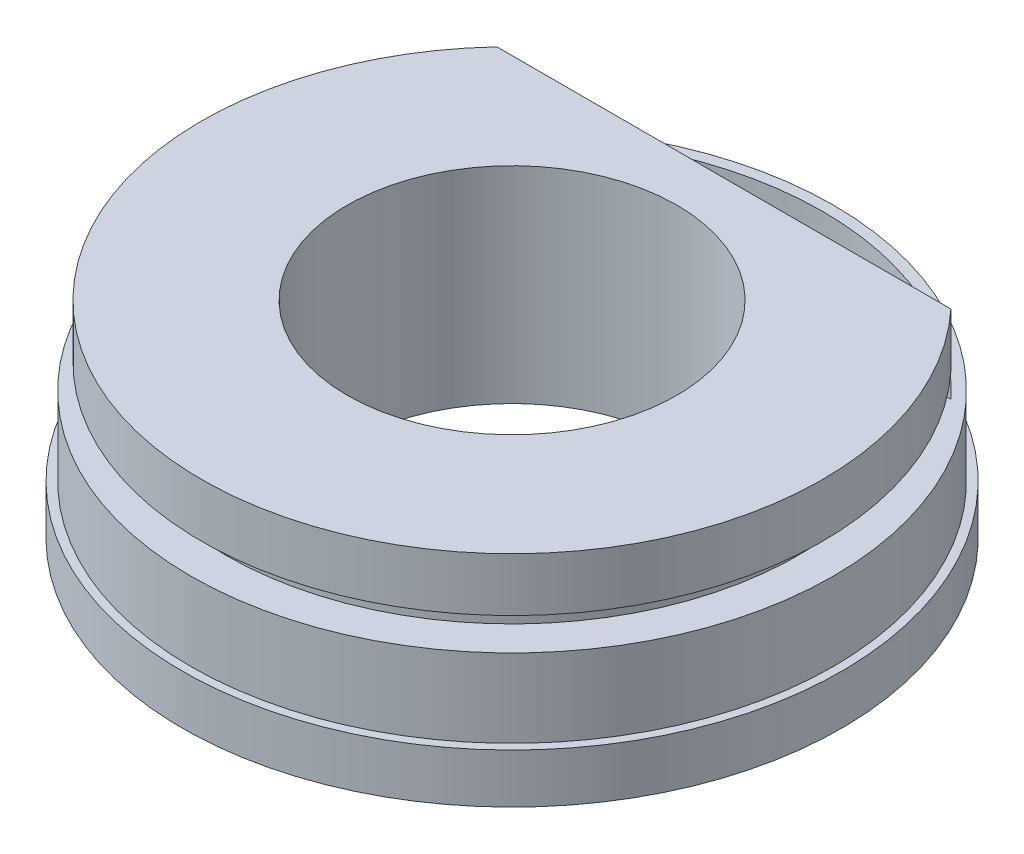
ISO-10303-21;
HEADER;
FILE_DESCRIPTION(('STEP AP214'),'2;1');
FILE_NAME('part.step','',(''),(''),'','','');
FILE_SCHEMA(('AUTOMOTIVE_DESIGN { 1 0 10303 214 1 1 1 1 }'));
ENDSEC;
DATA;
#1=APPLICATION_CONTEXT('core data for automotive mechanical design processes');
#2=APPLICATION_PROTOCOL_DEFINITION('international standard','automotive_design',2000,#1);
#3=PRODUCT_CONTEXT('',#1,'mechanical');
#4=PRODUCT('Part','Part','',(#3));
#5=PRODUCT_RELATED_PRODUCT_CATEGORY('part','',(#4));
#6=PRODUCT_DEFINITION_FORMATION('','',#4);
#7=PRODUCT_DEFINITION_CONTEXT('part definition',#1,'design');
#8=PRODUCT_DEFINITION('design','',#6,#7);
#9=PRODUCT_DEFINITION_SHAPE('','',#8);
#10=(LENGTH_UNIT() NAMED_UNIT(*) SI_UNIT(.MILLI.,.METRE.));
#11=(NAMED_UNIT(*) PLANE_ANGLE_UNIT() SI_UNIT($,.RADIAN.));
#12=(NAMED_UNIT(*) SI_UNIT($,.STERADIAN.) SOLID_ANGLE_UNIT());
#13=UNCERTAINTY_MEASURE_WITH_UNIT(LENGTH_MEASURE(1.E-05),#10,'distance_accuracy_value','');
#14=(GEOMETRIC_REPRESENTATION_CONTEXT(3) GLOBAL_UNCERTAINTY_ASSIGNED_CONTEXT((#13)) GLOBAL_UNIT_ASSIGNED_CONTEXT((#10,
#11,#12)) REPRESENTATION_CONTEXT('',''));
#15=CARTESIAN_POINT('',(0.,0.,0.));
#16=DIRECTION('',(0.,0.,1.));
#17=DIRECTION('',(1.,0.,0.));
#18=AXIS2_PLACEMENT_3D('',#15,#16,#17);
#19=CARTESIAN_POINT('',(0.,0.,0.));
#20=DIRECTION('',(0.,-1.,0.));
#21=DIRECTION('',(0.,0.,-1.));
#22=AXIS2_PLACEMENT_3D('',#19,#20,#21);
#23=CYLINDRICAL_SURFACE('',#22,20.);
#24=CARTESIAN_POINT('',(0.,3.,0.));
#25=DIRECTION('',(0.,-1.,0.));
#26=DIRECTION('',(0.,0.,-1.));
#27=AXIS2_PLACEMENT_3D('',#24,#25,#26);
#28=CIRCLE('',#27,20.);
#29=CARTESIAN_POINT('',(0.,3.,-20.));
#30=VERTEX_POINT('',#29);
#31=EDGE_CURVE('E12',#30,#30,#28,.T.);
#32=ORIENTED_EDGE('',*,*,#31,.T.);
#33=EDGE_LOOP('',(#32));
#34=FACE_BOUND('',#33,.T.);
#35=CARTESIAN_POINT('',(0.,0.,0.));
#36=DIRECTION('',(0.,-1.,0.));
#37=DIRECTION('',(0.,0.,-1.));
#38=AXIS2_PLACEMENT_3D('',#35,#36,#37);
#39=CIRCLE('',#38,20.);
#40=CARTESIAN_POINT('',(0.,0.,-20.));
#41=VERTEX_POINT('',#40);
#42=EDGE_CURVE('E136',#41,#41,#39,.T.);
#43=ORIENTED_EDGE('',*,*,#42,.F.);
#44=EDGE_LOOP('',(#43));
#45=FACE_BOUND('',#44,.T.);
#46=ADVANCED_FACE('F40',(#34,#45),#23,.T.);
#47=CARTESIAN_POINT('',(20.,3.,0.));
#48=DIRECTION('',(0.,1.,0.));
#49=DIRECTION('',(0.,0.,1.));
#50=AXIS2_PLACEMENT_3D('',#47,#48,#49);
#51=PLANE('',#50);
#52=CARTESIAN_POINT('',(0.,3.,0.));
#53=DIRECTION('',(0.,-1.,0.));
#54=DIRECTION('',(0.,0.,-1.));
#55=AXIS2_PLACEMENT_3D('',#52,#53,#54);
#56=CIRCLE('',#55,19.5);
#57=CARTESIAN_POINT('',(0.,3.,-19.5));
#58=VERTEX_POINT('',#57);
#59=EDGE_CURVE('E48',#58,#58,#56,.T.);
#60=ORIENTED_EDGE('',*,*,#59,.T.);
#61=EDGE_LOOP('',(#60));
#62=FACE_BOUND('',#61,.T.);
#63=ORIENTED_EDGE('',*,*,#31,.F.);
#64=EDGE_LOOP('',(#63));
#65=FACE_BOUND('',#64,.T.);
#66=ADVANCED_FACE('F171',(#62,#65),#51,.T.);
#67=CARTESIAN_POINT('',(0.,0.,0.));
#68=DIRECTION('',(0.,-1.,0.));
#69=DIRECTION('',(0.,0.,-1.));
#70=AXIS2_PLACEMENT_3D('',#67,#68,#69);
#71=CYLINDRICAL_SURFACE('',#70,19.5);
#72=CARTESIAN_POINT('',(0.,7.75,0.));
#73=DIRECTION('',(0.,-1.,0.));
#74=DIRECTION('',(0.,0.,-1.));
#75=AXIS2_PLACEMENT_3D('',#72,#73,#74);
#76=CIRCLE('',#75,19.5);
#77=CARTESIAN_POINT('',(0.,7.75,-19.5));
#78=VERTEX_POINT('',#77);
#79=EDGE_CURVE('E164',#78,#78,#76,.T.);
#80=ORIENTED_EDGE('',*,*,#79,.T.);
#81=EDGE_LOOP('',(#80));
#82=FACE_BOUND('',#81,.T.);
#83=ORIENTED_EDGE('',*,*,#59,.F.);
#84=EDGE_LOOP('',(#83));
#85=FACE_BOUND('',#84,.T.);
#86=ADVANCED_FACE('F174',(#82,#85),#71,.T.);
#87=CARTESIAN_POINT('',(19.5,7.75,0.));
#88=DIRECTION('',(0.,1.,0.));
#89=DIRECTION('',(0.,0.,1.));
#90=AXIS2_PLACEMENT_3D('',#87,#88,#89);
#91=PLANE('',#90);
#92=DIRECTION('',(1.,0.,0.));
#93=VECTOR('',#92,1.);
#94=CARTESIAN_POINT('',(19.5,7.75,-12.8566031065426));
#95=LINE('',#94,#93);
#96=CARTESIAN_POINT('',(-13.7761156733384,7.75,-12.8566031065426));
#97=VERTEX_POINT('',#96);
#98=CARTESIAN_POINT('',(-11.6404970840951,7.75,-12.8566031065426));
#99=VERTEX_POINT('',#98);
#100=EDGE_CURVE('E128',#97,#99,#95,.T.);
#101=ORIENTED_EDGE('',*,*,#100,.F.);
#102=CARTESIAN_POINT('',(0.,7.75,0.));
#103=DIRECTION('',(0.,1.,0.));
#104=DIRECTION('',(0.,0.,1.));
#105=AXIS2_PLACEMENT_3D('',#102,#103,#104);
#106=CIRCLE('',#105,18.8433968934574);
#107=CARTESIAN_POINT('',(13.7761156733384,7.75,-12.8566031065426));
#108=VERTEX_POINT('',#107);
#109=EDGE_CURVE('E99',#108,#97,#106,.T.);
#110=ORIENTED_EDGE('',*,*,#109,.F.);
#111=CARTESIAN_POINT('',(11.6404970840951,7.75,-12.8566031065426));
#112=VERTEX_POINT('',#111);
#113=EDGE_CURVE('E131',#112,#108,#95,.T.);
#114=ORIENTED_EDGE('',*,*,#113,.F.);
#115=CARTESIAN_POINT('',(0.,7.75,0.));
#116=DIRECTION('',(0.,-1.,0.));
#117=DIRECTION('',(0.,0.,-1.));
#118=AXIS2_PLACEMENT_3D('',#115,#116,#117);
#119=CIRCLE('',#118,17.3433968934574);
#120=EDGE_CURVE('E160',#112,#99,#119,.T.);
#121=ORIENTED_EDGE('',*,*,#120,.T.);
#122=EDGE_LOOP('',(#101,#110,#114,#121));
#123=FACE_BOUND('',#122,.T.);
#124=ORIENTED_EDGE('',*,*,#79,.F.);
#125=EDGE_LOOP('',(#124));
#126=FACE_BOUND('',#125,.T.);
#127=ADVANCED_FACE('F176',(#123,#126),#91,.T.);
#128=CARTESIAN_POINT('',(0.,0.,0.));
#129=DIRECTION('',(0.,-1.,0.));
#130=DIRECTION('',(0.,0.,-1.));
#131=AXIS2_PLACEMENT_3D('',#128,#129,#130);
#132=CYLINDRICAL_SURFACE('',#131,17.3433968934574);
#133=DIRECTION('',(0.,-1.,0.));
#134=VECTOR('',#133,1.);
#135=CARTESIAN_POINT('',(-11.6404970840951,0.,-12.8566031065426));
#136=LINE('',#135,#134);
#137=CARTESIAN_POINT('',(-11.6404970840951,9.25,-12.8566031065426));
#138=VERTEX_POINT('',#137);
#139=EDGE_CURVE('E124',#99,#138,#136,.F.);
#140=ORIENTED_EDGE('',*,*,#139,.F.);
#141=ORIENTED_EDGE('',*,*,#120,.F.);
#142=DIRECTION('',(0.,-1.,0.));
#143=VECTOR('',#142,1.);
#144=CARTESIAN_POINT('',(11.6404970840951,0.,-12.8566031065426));
#145=LINE('',#144,#143);
#146=CARTESIAN_POINT('',(11.6404970840951,9.25,-12.8566031065426));
#147=VERTEX_POINT('',#146);
#148=EDGE_CURVE('E62',#147,#112,#145,.T.);
#149=ORIENTED_EDGE('',*,*,#148,.F.);
#150=CARTESIAN_POINT('',(0.,9.25,0.));
#151=DIRECTION('',(0.,-1.,0.));
#152=DIRECTION('',(0.,0.,-1.));
#153=AXIS2_PLACEMENT_3D('',#150,#151,#152);
#154=CIRCLE('',#153,17.3433968934574);
#155=EDGE_CURVE('E156',#147,#138,#154,.T.);
#156=ORIENTED_EDGE('',*,*,#155,.T.);
#157=EDGE_LOOP('',(#140,#141,#149,#156));
#158=FACE_BOUND('',#157,.T.);
#159=ADVANCED_FACE('F183',(#158),#132,.T.);
#160=CARTESIAN_POINT('',(17.3433968934574,9.25,0.));
#161=DIRECTION('',(0.,-1.,0.));
#162=DIRECTION('',(0.,0.,-1.));
#163=AXIS2_PLACEMENT_3D('',#160,#161,#162);
#164=PLANE('',#163);
#165=DIRECTION('',(-1.,0.,0.));
#166=VECTOR('',#165,1.);
#167=CARTESIAN_POINT('',(17.3433968934574,9.25,-12.8566031065426));
#168=LINE('',#167,#166);
#169=CARTESIAN_POINT('',(13.7761156733384,9.25,-12.8566031065426));
#170=VERTEX_POINT('',#169);
#171=EDGE_CURVE('E125',#170,#147,#168,.T.);
#172=ORIENTED_EDGE('',*,*,#171,.F.);
#173=CARTESIAN_POINT('',(0.,9.25,0.));
#174=DIRECTION('',(0.,-1.,0.));
#175=DIRECTION('',(0.,0.,-1.));
#176=AXIS2_PLACEMENT_3D('',#173,#174,#175);
#177=CIRCLE('',#176,18.8433968934574);
#178=CARTESIAN_POINT('',(-13.7761156733384,9.25,-12.8566031065426));
#179=VERTEX_POINT('',#178);
#180=EDGE_CURVE('E152',#170,#179,#177,.T.);
#181=ORIENTED_EDGE('',*,*,#180,.T.);
#182=EDGE_CURVE('E120',#138,#179,#168,.T.);
#183=ORIENTED_EDGE('',*,*,#182,.F.);
#184=ORIENTED_EDGE('',*,*,#155,.F.);
#185=EDGE_LOOP('',(#172,#181,#183,#184));
#186=FACE_BOUND('',#185,.T.);
#187=ADVANCED_FACE('F214',(#186),#164,.T.);
#188=CARTESIAN_POINT('',(0.,0.,0.));
#189=DIRECTION('',(0.,-1.,0.));
#190=DIRECTION('',(0.,0.,-1.));
#191=AXIS2_PLACEMENT_3D('',#188,#189,#190);
#192=CYLINDRICAL_SURFACE('',#191,18.8433968934574);
#193=DIRECTION('',(0.,1.,0.));
#194=VECTOR('',#193,1.);
#195=CARTESIAN_POINT('',(-13.7761156733384,2.5,-12.8566031065426));
#196=LINE('',#195,#194);
#197=CARTESIAN_POINT('',(-13.7761156733384,12.5,-12.8566031065426));
#198=VERTEX_POINT('',#197);
#199=EDGE_CURVE('E55',#179,#198,#196,.T.);
#200=ORIENTED_EDGE('',*,*,#199,.F.);
#201=ORIENTED_EDGE('',*,*,#180,.F.);
#202=DIRECTION('',(0.,1.,0.));
#203=VECTOR('',#202,1.);
#204=CARTESIAN_POINT('',(13.7761156733384,2.5,-12.8566031065426));
#205=LINE('',#204,#203);
#206=CARTESIAN_POINT('',(13.7761156733384,12.5,-12.8566031065426));
#207=VERTEX_POINT('',#206);
#208=EDGE_CURVE('E103',#170,#207,#205,.T.);
#209=ORIENTED_EDGE('',*,*,#208,.T.);
#210=CARTESIAN_POINT('',(0.,12.5,0.));
#211=DIRECTION('',(0.,-1.,0.));
#212=DIRECTION('',(0.,0.,-1.));
#213=AXIS2_PLACEMENT_3D('',#210,#211,#212);
#214=CIRCLE('',#213,18.8433968934574);
#215=EDGE_CURVE('E148',#207,#198,#214,.T.);
#216=ORIENTED_EDGE('',*,*,#215,.T.);
#217=EDGE_LOOP('',(#200,#201,#209,#216));
#218=FACE_BOUND('',#217,.T.);
#219=ADVANCED_FACE('F208',(#218),#192,.T.);
#220=CARTESIAN_POINT('',(18.8433968934574,12.5,0.));
#221=DIRECTION('',(0.,1.,0.));
#222=DIRECTION('',(0.,0.,1.));
#223=AXIS2_PLACEMENT_3D('',#220,#221,#222);
#224=PLANE('',#223);
#225=DIRECTION('',(1.,0.,0.));
#226=VECTOR('',#225,1.);
#227=CARTESIAN_POINT('',(0.,12.5,-12.8566031065426));
#228=LINE('',#227,#226);
#229=EDGE_CURVE('E109',#198,#207,#228,.T.);
#230=ORIENTED_EDGE('',*,*,#229,.F.);
#231=ORIENTED_EDGE('',*,*,#215,.F.);
#232=EDGE_LOOP('',(#230,#231));
#233=FACE_BOUND('',#232,.T.);
#234=CARTESIAN_POINT('',(0.,12.5,0.));
#235=DIRECTION('',(0.,-1.,0.));
#236=DIRECTION('',(0.,0.,-1.));
#237=AXIS2_PLACEMENT_3D('',#234,#235,#236);
#238=CIRCLE('',#237,10.);
#239=CARTESIAN_POINT('',(0.,12.5,-10.));
#240=VERTEX_POINT('',#239);
#241=EDGE_CURVE('E144',#240,#240,#238,.T.);
#242=ORIENTED_EDGE('',*,*,#241,.T.);
#243=EDGE_LOOP('',(#242));
#244=FACE_BOUND('',#243,.T.);
#245=ADVANCED_FACE('F203',(#233,#244),#224,.T.);
#246=CARTESIAN_POINT('',(0.,0.,0.));
#247=DIRECTION('',(0.,-1.,0.));
#248=DIRECTION('',(0.,0.,-1.));
#249=AXIS2_PLACEMENT_3D('',#246,#247,#248);
#250=CYLINDRICAL_SURFACE('',#249,10.);
#251=CARTESIAN_POINT('',(0.,0.,0.));
#252=DIRECTION('',(0.,-1.,0.));
#253=DIRECTION('',(0.,0.,-1.));
#254=AXIS2_PLACEMENT_3D('',#251,#252,#253);
#255=CIRCLE('',#254,10.);
#256=CARTESIAN_POINT('',(0.,0.,-10.));
#257=VERTEX_POINT('',#256);
#258=EDGE_CURVE('E140',#257,#257,#255,.T.);
#259=ORIENTED_EDGE('',*,*,#258,.T.);
#260=EDGE_LOOP('',(#259));
#261=FACE_BOUND('',#260,.T.);
#262=ORIENTED_EDGE('',*,*,#241,.F.);
#263=EDGE_LOOP('',(#262));
#264=FACE_BOUND('',#263,.T.);
#265=ADVANCED_FACE('F197',(#261,#264),#250,.F.);
#266=CARTESIAN_POINT('',(10.,0.,0.));
#267=DIRECTION('',(0.,-1.,0.));
#268=DIRECTION('',(0.,0.,-1.));
#269=AXIS2_PLACEMENT_3D('',#266,#267,#268);
#270=PLANE('',#269);
#271=ORIENTED_EDGE('',*,*,#42,.T.);
#272=EDGE_LOOP('',(#271));
#273=FACE_BOUND('',#272,.T.);
#274=ORIENTED_EDGE('',*,*,#258,.F.);
#275=EDGE_LOOP('',(#274));
#276=FACE_BOUND('',#275,.T.);
#277=ADVANCED_FACE('F194',(#273,#276),#270,.T.);
#278=CARTESIAN_POINT('',(0.,2.5,0.));
#279=DIRECTION('',(0.,1.,0.));
#280=DIRECTION('',(0.,0.,1.));
#281=AXIS2_PLACEMENT_3D('',#278,#279,#280);
#282=CYLINDRICAL_SURFACE('',#281,18.8433968934574);
#283=ORIENTED_EDGE('',*,*,#109,.T.);
#284=CARTESIAN_POINT('',(-13.7761156733384,2.5,-12.8566031065426));
#285=VERTEX_POINT('',#284);
#286=EDGE_CURVE('E92',#285,#97,#196,.T.);
#287=ORIENTED_EDGE('',*,*,#286,.F.);
#288=CARTESIAN_POINT('',(0.,2.5,0.));
#289=DIRECTION('',(0.,1.,0.));
#290=DIRECTION('',(0.,0.,1.));
#291=AXIS2_PLACEMENT_3D('',#288,#289,#290);
#292=CIRCLE('',#291,18.8433968934574);
#293=CARTESIAN_POINT('',(13.7761156733384,2.5,-12.8566031065426));
#294=VERTEX_POINT('',#293);
#295=EDGE_CURVE('E96',#294,#285,#292,.T.);
#296=ORIENTED_EDGE('',*,*,#295,.F.);
#297=EDGE_CURVE('E112',#294,#108,#205,.T.);
#298=ORIENTED_EDGE('',*,*,#297,.T.);
#299=EDGE_LOOP('',(#283,#287,#296,#298));
#300=FACE_BOUND('',#299,.T.);
#301=ADVANCED_FACE('F94',(#300),#282,.F.);
#302=CARTESIAN_POINT('',(0.,2.5,-12.8566031065426));
#303=DIRECTION('',(0.,0.,1.));
#304=DIRECTION('',(1.,0.,0.));
#305=AXIS2_PLACEMENT_3D('',#302,#303,#304);
#306=PLANE('',#305);
#307=ORIENTED_EDGE('',*,*,#113,.T.);
#308=ORIENTED_EDGE('',*,*,#297,.F.);
#309=DIRECTION('',(1.,0.,0.));
#310=VECTOR('',#309,1.);
#311=CARTESIAN_POINT('',(0.,2.5,-12.8566031065426));
#312=LINE('',#311,#310);
#313=EDGE_CURVE('E107',#285,#294,#312,.T.);
#314=ORIENTED_EDGE('',*,*,#313,.F.);
#315=ORIENTED_EDGE('',*,*,#286,.T.);
#316=ORIENTED_EDGE('',*,*,#100,.T.);
#317=ORIENTED_EDGE('',*,*,#139,.T.);
#318=ORIENTED_EDGE('',*,*,#182,.T.);
#319=ORIENTED_EDGE('',*,*,#199,.T.);
#320=ORIENTED_EDGE('',*,*,#229,.T.);
#321=ORIENTED_EDGE('',*,*,#208,.F.);
#322=ORIENTED_EDGE('',*,*,#171,.T.);
#323=ORIENTED_EDGE('',*,*,#148,.T.);
#324=EDGE_LOOP('',(#307,#308,#314,#315,#316,#317,#318,#319,#320,#321,#322,#323));
#325=FACE_BOUND('',#324,.T.);
#326=ADVANCED_FACE('F111',(#325),#306,.F.);
#327=CARTESIAN_POINT('',(0.,2.5,0.));
#328=DIRECTION('',(0.,1.,0.));
#329=DIRECTION('',(0.,0.,1.));
#330=AXIS2_PLACEMENT_3D('',#327,#328,#329);
#331=PLANE('',#330);
#332=ORIENTED_EDGE('',*,*,#295,.T.);
#333=ORIENTED_EDGE('',*,*,#313,.T.);
#334=EDGE_LOOP('',(#332,#333));
#335=FACE_BOUND('',#334,.T.);
#336=ADVANCED_FACE('F106',(#335),#331,.T.);
#337=CLOSED_SHELL('',(#46,#66,#86,#127,#159,#187,#219,#245,#265,#277,#301,#326,#336));
#338=MANIFOLD_SOLID_BREP('B2',#337);
#339=ADVANCED_BREP_SHAPE_REPRESENTATION('',(#18,#338),#14);
#340=SHAPE_DEFINITION_REPRESENTATION(#9,#339);
ENDSEC;
END-ISO-10303-21;
